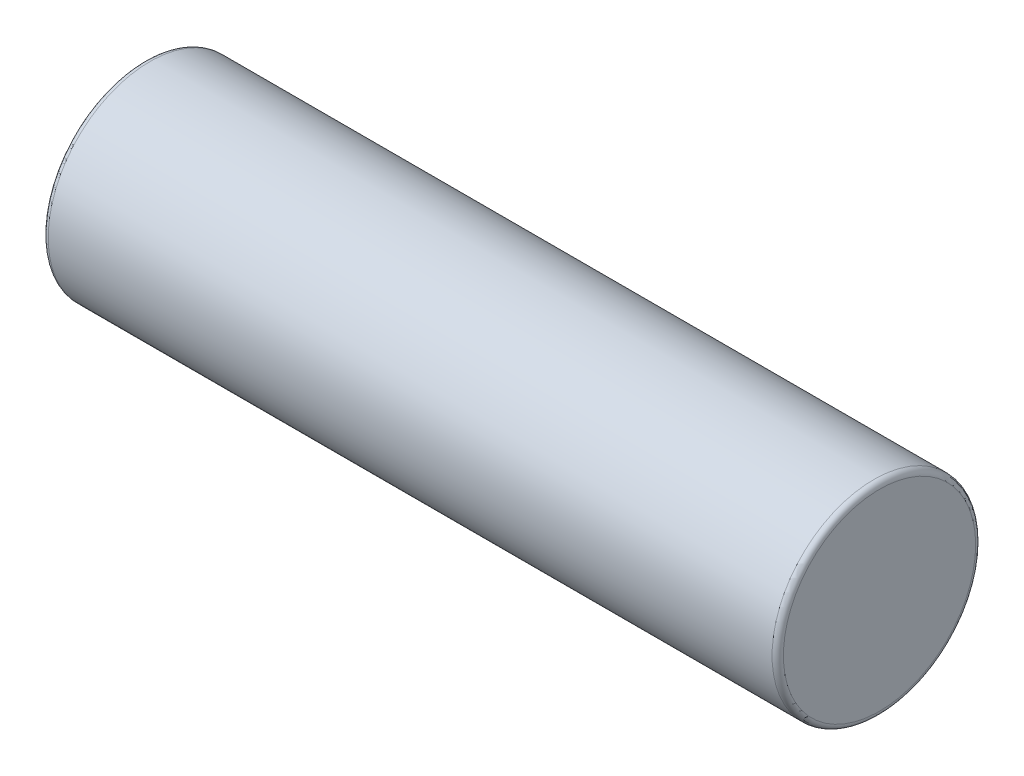
ISO-10303-21;
HEADER;
FILE_DESCRIPTION(('STEP AP214'),'2;1');
FILE_NAME('part.step','',(''),(''),'','','');
FILE_SCHEMA(('AUTOMOTIVE_DESIGN { 1 0 10303 214 1 1 1 1 }'));
ENDSEC;
DATA;
#1=APPLICATION_CONTEXT('core data for automotive mechanical design processes');
#2=APPLICATION_PROTOCOL_DEFINITION('international standard','automotive_design',2000,#1);
#3=PRODUCT_CONTEXT('',#1,'mechanical');
#4=PRODUCT('Part','Part','',(#3));
#5=PRODUCT_RELATED_PRODUCT_CATEGORY('part','',(#4));
#6=PRODUCT_DEFINITION_FORMATION('','',#4);
#7=PRODUCT_DEFINITION_CONTEXT('part definition',#1,'design');
#8=PRODUCT_DEFINITION('design','',#6,#7);
#9=PRODUCT_DEFINITION_SHAPE('','',#8);
#10=(LENGTH_UNIT() NAMED_UNIT(*) SI_UNIT(.MILLI.,.METRE.));
#11=(NAMED_UNIT(*) PLANE_ANGLE_UNIT() SI_UNIT($,.RADIAN.));
#12=(NAMED_UNIT(*) SI_UNIT($,.STERADIAN.) SOLID_ANGLE_UNIT());
#13=UNCERTAINTY_MEASURE_WITH_UNIT(LENGTH_MEASURE(1.E-05),#10,'distance_accuracy_value','');
#14=(GEOMETRIC_REPRESENTATION_CONTEXT(3) GLOBAL_UNCERTAINTY_ASSIGNED_CONTEXT((#13)) GLOBAL_UNIT_ASSIGNED_CONTEXT((#10,
#11,#12)) REPRESENTATION_CONTEXT('',''));
#15=CARTESIAN_POINT('',(0.,0.,0.));
#16=DIRECTION('',(0.,0.,1.));
#17=DIRECTION('',(1.,0.,0.));
#18=AXIS2_PLACEMENT_3D('',#15,#16,#17);
#19=CARTESIAN_POINT('',(65.,0.,0.));
#20=DIRECTION('',(-1.,0.,0.));
#21=DIRECTION('',(0.,0.,1.));
#22=AXIS2_PLACEMENT_3D('',#19,#20,#21);
#23=CYLINDRICAL_SURFACE('',#22,9.);
#24=CARTESIAN_POINT('',(0.5,0.,0.));
#25=DIRECTION('',(1.,0.,0.));
#26=DIRECTION('',(0.,0.,-1.));
#27=AXIS2_PLACEMENT_3D('',#24,#25,#26);
#28=CIRCLE('',#27,9.);
#29=CARTESIAN_POINT('',(0.5,0.,-9.));
#30=VERTEX_POINT('',#29);
#31=EDGE_CURVE('E42',#30,#30,#28,.T.);
#32=ORIENTED_EDGE('',*,*,#31,.T.);
#33=EDGE_LOOP('',(#32));
#34=FACE_BOUND('',#33,.T.);
#35=CARTESIAN_POINT('',(64.5,0.,0.));
#36=DIRECTION('',(1.,0.,0.));
#37=DIRECTION('',(0.,0.,-1.));
#38=AXIS2_PLACEMENT_3D('',#35,#36,#37);
#39=CIRCLE('',#38,9.);
#40=CARTESIAN_POINT('',(64.5,0.,-9.));
#41=VERTEX_POINT('',#40);
#42=EDGE_CURVE('E46',#41,#41,#39,.F.);
#43=ORIENTED_EDGE('',*,*,#42,.T.);
#44=EDGE_LOOP('',(#43));
#45=FACE_BOUND('',#44,.T.);
#46=ADVANCED_FACE('F31',(#34,#45),#23,.T.);
#47=CARTESIAN_POINT('',(65.,0.,0.));
#48=DIRECTION('',(1.,0.,0.));
#49=DIRECTION('',(0.,0.,-1.));
#50=AXIS2_PLACEMENT_3D('',#47,#48,#49);
#51=PLANE('',#50);
#52=CARTESIAN_POINT('',(65.,0.,0.));
#53=DIRECTION('',(1.,0.,0.));
#54=DIRECTION('',(0.,0.,-1.));
#55=AXIS2_PLACEMENT_3D('',#52,#53,#54);
#56=CIRCLE('',#55,8.5);
#57=CARTESIAN_POINT('',(65.,0.,-8.5));
#58=VERTEX_POINT('',#57);
#59=EDGE_CURVE('E10',#58,#58,#56,.T.);
#60=ORIENTED_EDGE('',*,*,#59,.T.);
#61=EDGE_LOOP('',(#60));
#62=FACE_BOUND('',#61,.T.);
#63=ADVANCED_FACE('F62',(#62),#51,.T.);
#64=CARTESIAN_POINT('',(0.,0.,0.));
#65=DIRECTION('',(1.,0.,0.));
#66=DIRECTION('',(0.,0.,-1.));
#67=AXIS2_PLACEMENT_3D('',#64,#65,#66);
#68=PLANE('',#67);
#69=CARTESIAN_POINT('',(0.,0.,0.));
#70=DIRECTION('',(1.,0.,0.));
#71=DIRECTION('',(0.,0.,-1.));
#72=AXIS2_PLACEMENT_3D('',#69,#70,#71);
#73=CIRCLE('',#72,8.5);
#74=CARTESIAN_POINT('',(0.,0.,-8.5));
#75=VERTEX_POINT('',#74);
#76=EDGE_CURVE('E38',#75,#75,#73,.F.);
#77=ORIENTED_EDGE('',*,*,#76,.T.);
#78=EDGE_LOOP('',(#77));
#79=FACE_BOUND('',#78,.T.);
#80=ADVANCED_FACE('F59',(#79),#68,.F.);
#81=CARTESIAN_POINT('',(0.5,0.,0.));
#82=DIRECTION('',(1.,0.,0.));
#83=DIRECTION('',(0.,0.,-1.));
#84=AXIS2_PLACEMENT_3D('',#81,#82,#83);
#85=TOROIDAL_SURFACE('',#84,8.5,0.5);
#86=ORIENTED_EDGE('',*,*,#76,.F.);
#87=EDGE_LOOP('',(#86));
#88=FACE_BOUND('',#87,.T.);
#89=ORIENTED_EDGE('',*,*,#31,.F.);
#90=EDGE_LOOP('',(#89));
#91=FACE_BOUND('',#90,.T.);
#92=ADVANCED_FACE('F55',(#88,#91),#85,.T.);
#93=CARTESIAN_POINT('',(64.5,0.,0.));
#94=DIRECTION('',(1.,0.,0.));
#95=DIRECTION('',(0.,0.,-1.));
#96=AXIS2_PLACEMENT_3D('',#93,#94,#95);
#97=TOROIDAL_SURFACE('',#96,8.5,0.5);
#98=ORIENTED_EDGE('',*,*,#42,.F.);
#99=EDGE_LOOP('',(#98));
#100=FACE_BOUND('',#99,.T.);
#101=ORIENTED_EDGE('',*,*,#59,.F.);
#102=EDGE_LOOP('',(#101));
#103=FACE_BOUND('',#102,.T.);
#104=ADVANCED_FACE('F33',(#100,#103),#97,.T.);
#105=CLOSED_SHELL('',(#46,#63,#80,#92,#104));
#106=MANIFOLD_SOLID_BREP('B2',#105);
#107=ADVANCED_BREP_SHAPE_REPRESENTATION('',(#18,#106),#14);
#108=SHAPE_DEFINITION_REPRESENTATION(#9,#107);
ENDSEC;
END-ISO-10303-21;
